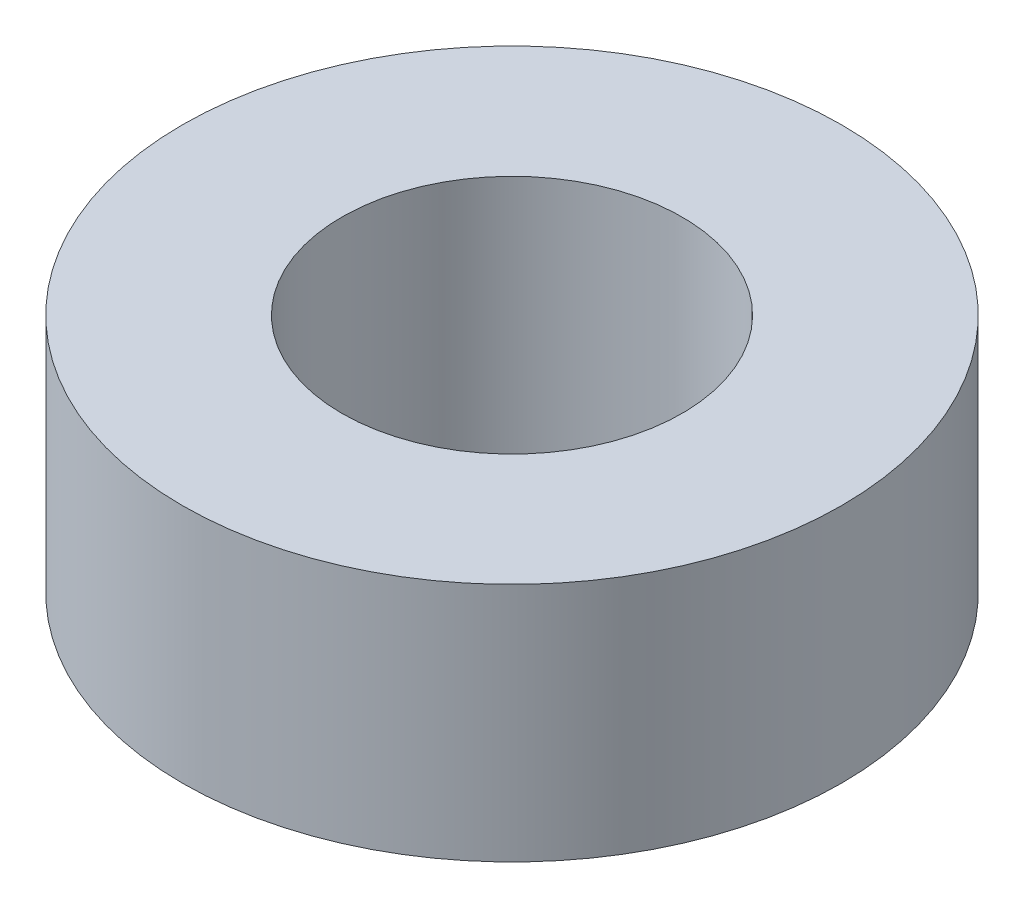
ISO-10303-21;
HEADER;
FILE_DESCRIPTION(('STEP AP214'),'2;1');
FILE_NAME('part.step','',(''),(''),'','','');
FILE_SCHEMA(('AUTOMOTIVE_DESIGN { 1 0 10303 214 1 1 1 1 }'));
ENDSEC;
DATA;
#1=APPLICATION_CONTEXT('core data for automotive mechanical design processes');
#2=APPLICATION_PROTOCOL_DEFINITION('international standard','automotive_design',2000,#1);
#3=PRODUCT_CONTEXT('',#1,'mechanical');
#4=PRODUCT('Part','Part','',(#3));
#5=PRODUCT_RELATED_PRODUCT_CATEGORY('part','',(#4));
#6=PRODUCT_DEFINITION_FORMATION('','',#4);
#7=PRODUCT_DEFINITION_CONTEXT('part definition',#1,'design');
#8=PRODUCT_DEFINITION('design','',#6,#7);
#9=PRODUCT_DEFINITION_SHAPE('','',#8);
#10=(LENGTH_UNIT() NAMED_UNIT(*) SI_UNIT(.MILLI.,.METRE.));
#11=(NAMED_UNIT(*) PLANE_ANGLE_UNIT() SI_UNIT($,.RADIAN.));
#12=(NAMED_UNIT(*) SI_UNIT($,.STERADIAN.) SOLID_ANGLE_UNIT());
#13=UNCERTAINTY_MEASURE_WITH_UNIT(LENGTH_MEASURE(1.E-05),#10,'distance_accuracy_value','');
#14=(GEOMETRIC_REPRESENTATION_CONTEXT(3) GLOBAL_UNCERTAINTY_ASSIGNED_CONTEXT((#13)) GLOBAL_UNIT_ASSIGNED_CONTEXT((#10,
#11,#12)) REPRESENTATION_CONTEXT('',''));
#15=CARTESIAN_POINT('',(0.,0.,0.));
#16=DIRECTION('',(0.,0.,1.));
#17=DIRECTION('',(1.,0.,0.));
#18=AXIS2_PLACEMENT_3D('',#15,#16,#17);
#19=CARTESIAN_POINT('',(0.,4.63042,0.));
#20=DIRECTION('',(0.,1.,0.));
#21=DIRECTION('',(0.,0.,1.));
#22=AXIS2_PLACEMENT_3D('',#19,#20,#21);
#23=PLANE('',#22);
#24=CARTESIAN_POINT('',(0.,4.63042,0.));
#25=DIRECTION('',(0.,1.,0.));
#26=DIRECTION('',(0.,0.,1.));
#27=AXIS2_PLACEMENT_3D('',#24,#25,#26);
#28=CIRCLE('',#27,6.35);
#29=CARTESIAN_POINT('',(0.,4.63042,6.35));
#30=VERTEX_POINT('',#29);
#31=EDGE_CURVE('E10',#30,#30,#28,.T.);
#32=ORIENTED_EDGE('',*,*,#31,.T.);
#33=EDGE_LOOP('',(#32));
#34=FACE_BOUND('',#33,.T.);
#35=CARTESIAN_POINT('',(0.,4.63042,0.));
#36=DIRECTION('',(0.,1.,0.));
#37=DIRECTION('',(0.,0.,1.));
#38=AXIS2_PLACEMENT_3D('',#35,#36,#37);
#39=CIRCLE('',#38,3.2766);
#40=CARTESIAN_POINT('',(0.,4.63042,3.2766));
#41=VERTEX_POINT('',#40);
#42=EDGE_CURVE('E54',#41,#41,#39,.T.);
#43=ORIENTED_EDGE('',*,*,#42,.F.);
#44=EDGE_LOOP('',(#43));
#45=FACE_BOUND('',#44,.T.);
#46=ADVANCED_FACE('F41',(#34,#45),#23,.T.);
#47=CARTESIAN_POINT('',(0.,0.,0.));
#48=DIRECTION('',(0.,1.,0.));
#49=DIRECTION('',(0.,0.,1.));
#50=AXIS2_PLACEMENT_3D('',#47,#48,#49);
#51=PLANE('',#50);
#52=CARTESIAN_POINT('',(0.,0.,0.));
#53=DIRECTION('',(0.,1.,0.));
#54=DIRECTION('',(0.,0.,1.));
#55=AXIS2_PLACEMENT_3D('',#52,#53,#54);
#56=CIRCLE('',#55,6.35);
#57=CARTESIAN_POINT('',(0.,0.,6.35));
#58=VERTEX_POINT('',#57);
#59=EDGE_CURVE('E45',#58,#58,#56,.T.);
#60=ORIENTED_EDGE('',*,*,#59,.F.);
#61=EDGE_LOOP('',(#60));
#62=FACE_BOUND('',#61,.T.);
#63=CARTESIAN_POINT('',(0.,0.,0.));
#64=DIRECTION('',(0.,1.,0.));
#65=DIRECTION('',(0.,0.,1.));
#66=AXIS2_PLACEMENT_3D('',#63,#64,#65);
#67=CIRCLE('',#66,3.2766);
#68=CARTESIAN_POINT('',(0.,0.,3.2766));
#69=VERTEX_POINT('',#68);
#70=EDGE_CURVE('E56',#69,#69,#67,.T.);
#71=ORIENTED_EDGE('',*,*,#70,.T.);
#72=EDGE_LOOP('',(#71));
#73=FACE_BOUND('',#72,.T.);
#74=ADVANCED_FACE('F68',(#62,#73),#51,.F.);
#75=CARTESIAN_POINT('',(0.,4.63042,0.));
#76=DIRECTION('',(0.,-1.,0.));
#77=DIRECTION('',(0.,0.,-1.));
#78=AXIS2_PLACEMENT_3D('',#75,#76,#77);
#79=CYLINDRICAL_SURFACE('',#78,6.35);
#80=ORIENTED_EDGE('',*,*,#31,.F.);
#81=EDGE_LOOP('',(#80));
#82=FACE_BOUND('',#81,.T.);
#83=ORIENTED_EDGE('',*,*,#59,.T.);
#84=EDGE_LOOP('',(#83));
#85=FACE_BOUND('',#84,.T.);
#86=ADVANCED_FACE('F43',(#82,#85),#79,.T.);
#87=CARTESIAN_POINT('',(0.,4.63042,0.));
#88=DIRECTION('',(0.,-1.,0.));
#89=DIRECTION('',(0.,0.,-1.));
#90=AXIS2_PLACEMENT_3D('',#87,#88,#89);
#91=CYLINDRICAL_SURFACE('',#90,3.2766);
#92=ORIENTED_EDGE('',*,*,#42,.T.);
#93=EDGE_LOOP('',(#92));
#94=FACE_BOUND('',#93,.T.);
#95=ORIENTED_EDGE('',*,*,#70,.F.);
#96=EDGE_LOOP('',(#95));
#97=FACE_BOUND('',#96,.T.);
#98=ADVANCED_FACE('F64',(#94,#97),#91,.F.);
#99=CLOSED_SHELL('',(#46,#74,#86,#98));
#100=MANIFOLD_SOLID_BREP('B2',#99);
#101=ADVANCED_BREP_SHAPE_REPRESENTATION('',(#18,#100),#14);
#102=SHAPE_DEFINITION_REPRESENTATION(#9,#101);
ENDSEC;
END-ISO-10303-21;
